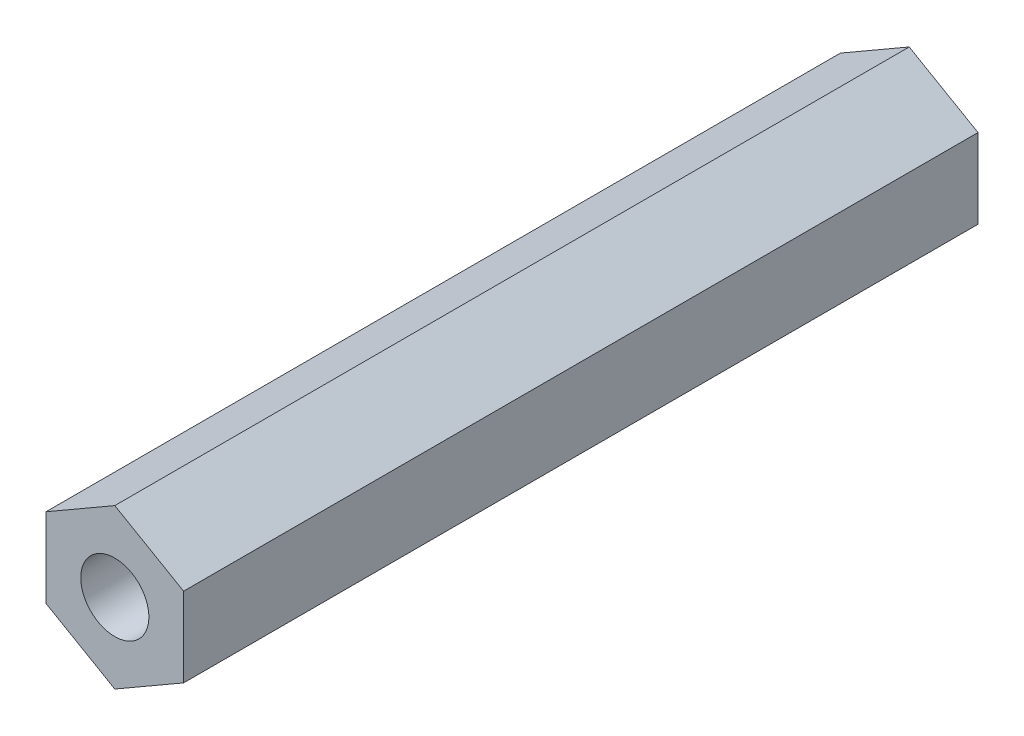
ISO-10303-21;
HEADER;
FILE_DESCRIPTION(('STEP AP214'),'2;1');
FILE_NAME('part.step','',(''),(''),'','','');
FILE_SCHEMA(('AUTOMOTIVE_DESIGN { 1 0 10303 214 1 1 1 1 }'));
ENDSEC;
DATA;
#1=APPLICATION_CONTEXT('core data for automotive mechanical design processes');
#2=APPLICATION_PROTOCOL_DEFINITION('international standard','automotive_design',2000,#1);
#3=PRODUCT_CONTEXT('',#1,'mechanical');
#4=PRODUCT('Part','Part','',(#3));
#5=PRODUCT_RELATED_PRODUCT_CATEGORY('part','',(#4));
#6=PRODUCT_DEFINITION_FORMATION('','',#4);
#7=PRODUCT_DEFINITION_CONTEXT('part definition',#1,'design');
#8=PRODUCT_DEFINITION('design','',#6,#7);
#9=PRODUCT_DEFINITION_SHAPE('','',#8);
#10=(LENGTH_UNIT() NAMED_UNIT(*) SI_UNIT(.MILLI.,.METRE.));
#11=(NAMED_UNIT(*) PLANE_ANGLE_UNIT() SI_UNIT($,.RADIAN.));
#12=(NAMED_UNIT(*) SI_UNIT($,.STERADIAN.) SOLID_ANGLE_UNIT());
#13=UNCERTAINTY_MEASURE_WITH_UNIT(LENGTH_MEASURE(1.E-05),#10,'distance_accuracy_value','');
#14=(GEOMETRIC_REPRESENTATION_CONTEXT(3) GLOBAL_UNCERTAINTY_ASSIGNED_CONTEXT((#13)) GLOBAL_UNIT_ASSIGNED_CONTEXT((#10,
#11,#12)) REPRESENTATION_CONTEXT('',''));
#15=CARTESIAN_POINT('',(0.,0.,0.));
#16=DIRECTION('',(0.,0.,1.));
#17=DIRECTION('',(1.,0.,0.));
#18=AXIS2_PLACEMENT_3D('',#15,#16,#17);
#19=CARTESIAN_POINT('',(3.03108891324553,-1.75,35.));
#20=DIRECTION('',(-1.,0.,0.));
#21=DIRECTION('',(0.,0.,1.));
#22=AXIS2_PLACEMENT_3D('',#19,#20,#21);
#23=PLANE('',#22);
#24=DIRECTION('',(0.,1.,0.));
#25=VECTOR('',#24,1.);
#26=CARTESIAN_POINT('',(3.03108891324553,-1.75,0.));
#27=LINE('',#26,#25);
#28=CARTESIAN_POINT('',(3.03108891324553,-1.75,0.));
#29=VERTEX_POINT('',#28);
#30=CARTESIAN_POINT('',(3.03108891324553,1.75,0.));
#31=VERTEX_POINT('',#30);
#32=EDGE_CURVE('E119',#29,#31,#27,.T.);
#33=ORIENTED_EDGE('',*,*,#32,.T.);
#34=DIRECTION('',(0.,0.,-1.));
#35=VECTOR('',#34,1.);
#36=CARTESIAN_POINT('',(3.03108891324553,1.75,35.));
#37=LINE('',#36,#35);
#38=CARTESIAN_POINT('',(3.03108891324553,1.75,35.));
#39=VERTEX_POINT('',#38);
#40=EDGE_CURVE('E11',#39,#31,#37,.T.);
#41=ORIENTED_EDGE('',*,*,#40,.F.);
#42=DIRECTION('',(0.,1.,0.));
#43=VECTOR('',#42,1.);
#44=CARTESIAN_POINT('',(3.03108891324553,-1.75,35.));
#45=LINE('',#44,#43);
#46=CARTESIAN_POINT('',(3.03108891324553,-1.75,35.));
#47=VERTEX_POINT('',#46);
#48=EDGE_CURVE('E130',#47,#39,#45,.T.);
#49=ORIENTED_EDGE('',*,*,#48,.F.);
#50=DIRECTION('',(0.,0.,-1.));
#51=VECTOR('',#50,1.);
#52=CARTESIAN_POINT('',(3.03108891324553,-1.75,35.));
#53=LINE('',#52,#51);
#54=EDGE_CURVE('E115',#47,#29,#53,.T.);
#55=ORIENTED_EDGE('',*,*,#54,.T.);
#56=EDGE_LOOP('',(#33,#41,#49,#55));
#57=FACE_BOUND('',#56,.T.);
#58=ADVANCED_FACE('F35',(#57),#23,.F.);
#59=CARTESIAN_POINT('',(3.03108891324553,1.75,35.));
#60=DIRECTION('',(-0.5,-0.866025403784439,0.));
#61=DIRECTION('',(0.866025403784439,-0.5,0.));
#62=AXIS2_PLACEMENT_3D('',#59,#60,#61);
#63=PLANE('',#62);
#64=DIRECTION('',(-0.866025403784439,0.5,0.));
#65=VECTOR('',#64,1.);
#66=CARTESIAN_POINT('',(3.03108891324553,1.75,0.));
#67=LINE('',#66,#65);
#68=CARTESIAN_POINT('',(0.,3.5,0.));
#69=VERTEX_POINT('',#68);
#70=EDGE_CURVE('E122',#31,#69,#67,.T.);
#71=ORIENTED_EDGE('',*,*,#70,.T.);
#72=DIRECTION('',(0.,0.,-1.));
#73=VECTOR('',#72,1.);
#74=CARTESIAN_POINT('',(0.,3.5,35.));
#75=LINE('',#74,#73);
#76=CARTESIAN_POINT('',(0.,3.5,35.));
#77=VERTEX_POINT('',#76);
#78=EDGE_CURVE('E43',#77,#69,#75,.T.);
#79=ORIENTED_EDGE('',*,*,#78,.F.);
#80=DIRECTION('',(-0.866025403784439,0.5,0.));
#81=VECTOR('',#80,1.);
#82=CARTESIAN_POINT('',(3.03108891324553,1.75,35.));
#83=LINE('',#82,#81);
#84=EDGE_CURVE('E88',#39,#77,#83,.T.);
#85=ORIENTED_EDGE('',*,*,#84,.F.);
#86=ORIENTED_EDGE('',*,*,#40,.T.);
#87=EDGE_LOOP('',(#71,#79,#85,#86));
#88=FACE_BOUND('',#87,.T.);
#89=ADVANCED_FACE('F155',(#88),#63,.F.);
#90=CARTESIAN_POINT('',(0.,3.5,35.));
#91=DIRECTION('',(0.5,-0.866025403784439,0.));
#92=DIRECTION('',(0.866025403784439,0.5,0.));
#93=AXIS2_PLACEMENT_3D('',#90,#91,#92);
#94=PLANE('',#93);
#95=DIRECTION('',(-0.866025403784438,-0.5,0.));
#96=VECTOR('',#95,1.);
#97=CARTESIAN_POINT('',(0.,3.5,0.));
#98=LINE('',#97,#96);
#99=CARTESIAN_POINT('',(-3.03108891324554,1.75,0.));
#100=VERTEX_POINT('',#99);
#101=EDGE_CURVE('E125',#69,#100,#98,.T.);
#102=ORIENTED_EDGE('',*,*,#101,.T.);
#103=DIRECTION('',(0.,0.,-1.));
#104=VECTOR('',#103,1.);
#105=CARTESIAN_POINT('',(-3.03108891324554,1.75,35.));
#106=LINE('',#105,#104);
#107=CARTESIAN_POINT('',(-3.03108891324554,1.75,35.));
#108=VERTEX_POINT('',#107);
#109=EDGE_CURVE('E110',#108,#100,#106,.T.);
#110=ORIENTED_EDGE('',*,*,#109,.F.);
#111=DIRECTION('',(-0.866025403784438,-0.5,0.));
#112=VECTOR('',#111,1.);
#113=CARTESIAN_POINT('',(0.,3.5,35.));
#114=LINE('',#113,#112);
#115=EDGE_CURVE('E101',#77,#108,#114,.T.);
#116=ORIENTED_EDGE('',*,*,#115,.F.);
#117=ORIENTED_EDGE('',*,*,#78,.T.);
#118=EDGE_LOOP('',(#102,#110,#116,#117));
#119=FACE_BOUND('',#118,.T.);
#120=ADVANCED_FACE('F136',(#119),#94,.F.);
#121=CARTESIAN_POINT('',(-3.03108891324554,1.75,35.));
#122=DIRECTION('',(1.,0.,0.));
#123=DIRECTION('',(0.,1.,0.));
#124=AXIS2_PLACEMENT_3D('',#121,#122,#123);
#125=PLANE('',#124);
#126=DIRECTION('',(0.,-1.,0.));
#127=VECTOR('',#126,1.);
#128=CARTESIAN_POINT('',(-3.03108891324554,1.75,0.));
#129=LINE('',#128,#127);
#130=CARTESIAN_POINT('',(-3.03108891324554,-1.75,0.));
#131=VERTEX_POINT('',#130);
#132=EDGE_CURVE('E109',#100,#131,#129,.T.);
#133=ORIENTED_EDGE('',*,*,#132,.T.);
#134=DIRECTION('',(0.,0.,-1.));
#135=VECTOR('',#134,1.);
#136=CARTESIAN_POINT('',(-3.03108891324554,-1.75,35.));
#137=LINE('',#136,#135);
#138=CARTESIAN_POINT('',(-3.03108891324554,-1.75,35.));
#139=VERTEX_POINT('',#138);
#140=EDGE_CURVE('E106',#139,#131,#137,.T.);
#141=ORIENTED_EDGE('',*,*,#140,.F.);
#142=DIRECTION('',(0.,-1.,0.));
#143=VECTOR('',#142,1.);
#144=CARTESIAN_POINT('',(-3.03108891324554,1.75,35.));
#145=LINE('',#144,#143);
#146=EDGE_CURVE('E95',#108,#139,#145,.T.);
#147=ORIENTED_EDGE('',*,*,#146,.F.);
#148=ORIENTED_EDGE('',*,*,#109,.T.);
#149=EDGE_LOOP('',(#133,#141,#147,#148));
#150=FACE_BOUND('',#149,.T.);
#151=ADVANCED_FACE('F107',(#150),#125,.F.);
#152=CARTESIAN_POINT('',(-3.03108891324554,-1.75,35.));
#153=DIRECTION('',(0.5,0.866025403784439,0.));
#154=DIRECTION('',(-0.866025403784439,0.5,0.));
#155=AXIS2_PLACEMENT_3D('',#152,#153,#154);
#156=PLANE('',#155);
#157=DIRECTION('',(0.866025403784439,-0.5,0.));
#158=VECTOR('',#157,1.);
#159=CARTESIAN_POINT('',(-3.03108891324554,-1.75,0.));
#160=LINE('',#159,#158);
#161=CARTESIAN_POINT('',(0.,-3.5,0.));
#162=VERTEX_POINT('',#161);
#163=EDGE_CURVE('E74',#131,#162,#160,.T.);
#164=ORIENTED_EDGE('',*,*,#163,.T.);
#165=DIRECTION('',(0.,0.,-1.));
#166=VECTOR('',#165,1.);
#167=CARTESIAN_POINT('',(0.,-3.5,35.));
#168=LINE('',#167,#166);
#169=CARTESIAN_POINT('',(0.,-3.5,35.));
#170=VERTEX_POINT('',#169);
#171=EDGE_CURVE('E111',#170,#162,#168,.T.);
#172=ORIENTED_EDGE('',*,*,#171,.F.);
#173=DIRECTION('',(0.866025403784439,-0.5,0.));
#174=VECTOR('',#173,1.);
#175=CARTESIAN_POINT('',(-3.03108891324554,-1.75,35.));
#176=LINE('',#175,#174);
#177=EDGE_CURVE('E99',#139,#170,#176,.T.);
#178=ORIENTED_EDGE('',*,*,#177,.F.);
#179=ORIENTED_EDGE('',*,*,#140,.T.);
#180=EDGE_LOOP('',(#164,#172,#178,#179));
#181=FACE_BOUND('',#180,.T.);
#182=ADVANCED_FACE('F113',(#181),#156,.F.);
#183=CARTESIAN_POINT('',(0.,-3.5,35.));
#184=DIRECTION('',(-0.5,0.866025403784438,0.));
#185=DIRECTION('',(-0.866025403784438,-0.5,0.));
#186=AXIS2_PLACEMENT_3D('',#183,#184,#185);
#187=PLANE('',#186);
#188=DIRECTION('',(0.866025403784438,0.5,0.));
#189=VECTOR('',#188,1.);
#190=CARTESIAN_POINT('',(0.,-3.5,0.));
#191=LINE('',#190,#189);
#192=EDGE_CURVE('E80',#162,#29,#191,.T.);
#193=ORIENTED_EDGE('',*,*,#192,.T.);
#194=ORIENTED_EDGE('',*,*,#54,.F.);
#195=DIRECTION('',(0.866025403784438,0.5,0.));
#196=VECTOR('',#195,1.);
#197=CARTESIAN_POINT('',(0.,-3.5,35.));
#198=LINE('',#197,#196);
#199=EDGE_CURVE('E51',#170,#47,#198,.T.);
#200=ORIENTED_EDGE('',*,*,#199,.F.);
#201=ORIENTED_EDGE('',*,*,#171,.T.);
#202=EDGE_LOOP('',(#193,#194,#200,#201));
#203=FACE_BOUND('',#202,.T.);
#204=ADVANCED_FACE('F143',(#203),#187,.F.);
#205=CARTESIAN_POINT('',(0.,0.,35.));
#206=DIRECTION('',(0.,0.,1.));
#207=DIRECTION('',(1.,0.,0.));
#208=AXIS2_PLACEMENT_3D('',#205,#206,#207);
#209=PLANE('',#208);
#210=CARTESIAN_POINT('',(0.,0.,35.));
#211=DIRECTION('',(0.,0.,-1.));
#212=DIRECTION('',(-1.,0.,0.));
#213=AXIS2_PLACEMENT_3D('',#210,#211,#212);
#214=CIRCLE('',#213,1.5);
#215=CARTESIAN_POINT('',(-1.5,0.,35.));
#216=VERTEX_POINT('',#215);
#217=EDGE_CURVE('E123',#216,#216,#214,.T.);
#218=ORIENTED_EDGE('',*,*,#217,.T.);
#219=EDGE_LOOP('',(#218));
#220=FACE_BOUND('',#219,.T.);
#221=ORIENTED_EDGE('',*,*,#48,.T.);
#222=ORIENTED_EDGE('',*,*,#84,.T.);
#223=ORIENTED_EDGE('',*,*,#115,.T.);
#224=ORIENTED_EDGE('',*,*,#146,.T.);
#225=ORIENTED_EDGE('',*,*,#177,.T.);
#226=ORIENTED_EDGE('',*,*,#199,.T.);
#227=EDGE_LOOP('',(#221,#222,#223,#224,#225,#226));
#228=FACE_BOUND('',#227,.T.);
#229=ADVANCED_FACE('F97',(#220,#228),#209,.T.);
#230=CARTESIAN_POINT('',(0.,0.,0.));
#231=DIRECTION('',(0.,0.,1.));
#232=DIRECTION('',(1.,0.,0.));
#233=AXIS2_PLACEMENT_3D('',#230,#231,#232);
#234=PLANE('',#233);
#235=CARTESIAN_POINT('',(0.,0.,0.));
#236=DIRECTION('',(0.,0.,-1.));
#237=DIRECTION('',(-1.,0.,0.));
#238=AXIS2_PLACEMENT_3D('',#235,#236,#237);
#239=CIRCLE('',#238,1.5);
#240=CARTESIAN_POINT('',(-1.5,0.,0.));
#241=VERTEX_POINT('',#240);
#242=EDGE_CURVE('E210',#241,#241,#239,.T.);
#243=ORIENTED_EDGE('',*,*,#242,.F.);
#244=EDGE_LOOP('',(#243));
#245=FACE_BOUND('',#244,.T.);
#246=ORIENTED_EDGE('',*,*,#32,.F.);
#247=ORIENTED_EDGE('',*,*,#192,.F.);
#248=ORIENTED_EDGE('',*,*,#163,.F.);
#249=ORIENTED_EDGE('',*,*,#132,.F.);
#250=ORIENTED_EDGE('',*,*,#101,.F.);
#251=ORIENTED_EDGE('',*,*,#70,.F.);
#252=EDGE_LOOP('',(#246,#247,#248,#249,#250,#251));
#253=FACE_BOUND('',#252,.T.);
#254=ADVANCED_FACE('F139',(#245,#253),#234,.F.);
#255=CARTESIAN_POINT('',(0.,0.,35.));
#256=DIRECTION('',(0.,0.,-1.));
#257=DIRECTION('',(-1.,0.,0.));
#258=AXIS2_PLACEMENT_3D('',#255,#256,#257);
#259=CYLINDRICAL_SURFACE('',#258,1.5);
#260=ORIENTED_EDGE('',*,*,#217,.F.);
#261=EDGE_LOOP('',(#260));
#262=FACE_BOUND('',#261,.T.);
#263=ORIENTED_EDGE('',*,*,#242,.T.);
#264=EDGE_LOOP('',(#263));
#265=FACE_BOUND('',#264,.T.);
#266=ADVANCED_FACE('F192',(#262,#265),#259,.F.);
#267=CLOSED_SHELL('',(#58,#89,#120,#151,#182,#204,#229,#254,#266));
#268=MANIFOLD_SOLID_BREP('B2',#267);
#269=ADVANCED_BREP_SHAPE_REPRESENTATION('',(#18,#268),#14);
#270=SHAPE_DEFINITION_REPRESENTATION(#9,#269);
ENDSEC;
END-ISO-10303-21;
